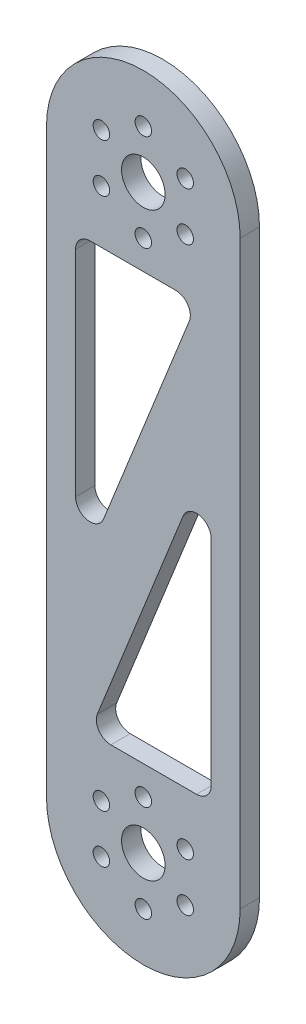
ISO-10303-21;
HEADER;
FILE_DESCRIPTION(('STEP AP214'),'2;1');
FILE_NAME('part.step','',(''),(''),'','','');
FILE_SCHEMA(('AUTOMOTIVE_DESIGN { 1 0 10303 214 1 1 1 1 }'));
ENDSEC;
DATA;
#1=APPLICATION_CONTEXT('core data for automotive mechanical design processes');
#2=APPLICATION_PROTOCOL_DEFINITION('international standard','automotive_design',2000,#1);
#3=PRODUCT_CONTEXT('',#1,'mechanical');
#4=PRODUCT('Part','Part','',(#3));
#5=PRODUCT_RELATED_PRODUCT_CATEGORY('part','',(#4));
#6=PRODUCT_DEFINITION_FORMATION('','',#4);
#7=PRODUCT_DEFINITION_CONTEXT('part definition',#1,'design');
#8=PRODUCT_DEFINITION('design','',#6,#7);
#9=PRODUCT_DEFINITION_SHAPE('','',#8);
#10=(LENGTH_UNIT() NAMED_UNIT(*) SI_UNIT(.MILLI.,.METRE.));
#11=(NAMED_UNIT(*) PLANE_ANGLE_UNIT() SI_UNIT($,.RADIAN.));
#12=(NAMED_UNIT(*) SI_UNIT($,.STERADIAN.) SOLID_ANGLE_UNIT());
#13=UNCERTAINTY_MEASURE_WITH_UNIT(LENGTH_MEASURE(1.E-05),#10,'distance_accuracy_value','');
#14=(GEOMETRIC_REPRESENTATION_CONTEXT(3) GLOBAL_UNCERTAINTY_ASSIGNED_CONTEXT((#13)) GLOBAL_UNIT_ASSIGNED_CONTEXT((#10,
#11,#12)) REPRESENTATION_CONTEXT('',''));
#15=CARTESIAN_POINT('',(0.,0.,0.));
#16=DIRECTION('',(0.,0.,1.));
#17=DIRECTION('',(1.,0.,0.));
#18=AXIS2_PLACEMENT_3D('',#15,#16,#17);
#19=CARTESIAN_POINT('',(0.,-60.,4.));
#20=DIRECTION('',(0.,0.,1.));
#21=DIRECTION('',(1.,0.,0.));
#22=AXIS2_PLACEMENT_3D('',#19,#20,#21);
#23=PLANE('',#22);
#24=CARTESIAN_POINT('',(-8.66025403784427,-54.9999999999998,4.));
#25=DIRECTION('',(0.,0.,1.));
#26=DIRECTION('',(-1.,0.,0.));
#27=AXIS2_PLACEMENT_3D('',#24,#25,#26);
#28=CIRCLE('',#27,1.69999999999973);
#29=CARTESIAN_POINT('',(-10.360254037844,-54.9999999999998,4.));
#30=VERTEX_POINT('',#29);
#31=EDGE_CURVE('E400',#30,#30,#28,.T.);
#32=ORIENTED_EDGE('',*,*,#31,.F.);
#33=EDGE_LOOP('',(#32));
#34=FACE_BOUND('',#33,.T.);
#35=CARTESIAN_POINT('',(-8.66025403784437,-65.,4.));
#36=DIRECTION('',(0.,0.,1.));
#37=DIRECTION('',(-1.,0.,0.));
#38=AXIS2_PLACEMENT_3D('',#35,#36,#37);
#39=CIRCLE('',#38,1.7);
#40=CARTESIAN_POINT('',(-10.3602540378444,-65.,4.));
#41=VERTEX_POINT('',#40);
#42=EDGE_CURVE('E430',#41,#41,#39,.T.);
#43=ORIENTED_EDGE('',*,*,#42,.F.);
#44=EDGE_LOOP('',(#43));
#45=FACE_BOUND('',#44,.T.);
#46=CARTESIAN_POINT('',(0.,-70.,4.));
#47=DIRECTION('',(0.,0.,1.));
#48=DIRECTION('',(-1.,0.,0.));
#49=AXIS2_PLACEMENT_3D('',#46,#47,#48);
#50=CIRCLE('',#49,1.7);
#51=CARTESIAN_POINT('',(-1.69999999999993,-70.,4.));
#52=VERTEX_POINT('',#51);
#53=EDGE_CURVE('E424',#52,#52,#50,.T.);
#54=ORIENTED_EDGE('',*,*,#53,.F.);
#55=EDGE_LOOP('',(#54));
#56=FACE_BOUND('',#55,.T.);
#57=CARTESIAN_POINT('',(8.66025403784415,55.,4.));
#58=DIRECTION('',(0.,0.,1.));
#59=DIRECTION('',(1.,0.,0.));
#60=AXIS2_PLACEMENT_3D('',#57,#58,#59);
#61=CIRCLE('',#60,1.69999999999993);
#62=CARTESIAN_POINT('',(10.3602540378441,55.,4.));
#63=VERTEX_POINT('',#62);
#64=EDGE_CURVE('E418',#63,#63,#61,.T.);
#65=ORIENTED_EDGE('',*,*,#64,.F.);
#66=EDGE_LOOP('',(#65));
#67=FACE_BOUND('',#66,.T.);
#68=CARTESIAN_POINT('',(8.66025403784442,64.9999999999999,4.));
#69=DIRECTION('',(0.,0.,1.));
#70=DIRECTION('',(1.,0.,0.));
#71=AXIS2_PLACEMENT_3D('',#68,#69,#70);
#72=CIRCLE('',#71,1.69999999999999);
#73=CARTESIAN_POINT('',(10.3602540378444,64.9999999999999,4.));
#74=VERTEX_POINT('',#73);
#75=EDGE_CURVE('E417',#74,#74,#72,.T.);
#76=ORIENTED_EDGE('',*,*,#75,.F.);
#77=EDGE_LOOP('',(#76));
#78=FACE_BOUND('',#77,.T.);
#79=CARTESIAN_POINT('',(0.,70.,4.));
#80=DIRECTION('',(0.,0.,1.));
#81=DIRECTION('',(1.,0.,0.));
#82=AXIS2_PLACEMENT_3D('',#79,#80,#81);
#83=CIRCLE('',#82,1.7);
#84=CARTESIAN_POINT('',(1.70000000000007,70.,4.));
#85=VERTEX_POINT('',#84);
#86=EDGE_CURVE('E454',#85,#85,#83,.T.);
#87=ORIENTED_EDGE('',*,*,#86,.F.);
#88=EDGE_LOOP('',(#87));
#89=FACE_BOUND('',#88,.T.);
#90=CARTESIAN_POINT('',(-8.66025403784437,65.,4.));
#91=DIRECTION('',(0.,0.,1.));
#92=DIRECTION('',(1.,0.,0.));
#93=AXIS2_PLACEMENT_3D('',#90,#91,#92);
#94=CIRCLE('',#93,1.7);
#95=CARTESIAN_POINT('',(-6.96025403784436,65.,4.));
#96=VERTEX_POINT('',#95);
#97=EDGE_CURVE('E448',#96,#96,#94,.T.);
#98=ORIENTED_EDGE('',*,*,#97,.F.);
#99=EDGE_LOOP('',(#98));
#100=FACE_BOUND('',#99,.T.);
#101=CARTESIAN_POINT('',(-8.66025403784426,54.9999999999998,4.));
#102=DIRECTION('',(0.,0.,1.));
#103=DIRECTION('',(1.,0.,0.));
#104=AXIS2_PLACEMENT_3D('',#101,#102,#103);
#105=CIRCLE('',#104,1.69999999999974);
#106=CARTESIAN_POINT('',(-6.96025403784452,54.9999999999998,4.));
#107=VERTEX_POINT('',#106);
#108=EDGE_CURVE('E442',#107,#107,#105,.T.);
#109=ORIENTED_EDGE('',*,*,#108,.F.);
#110=EDGE_LOOP('',(#109));
#111=FACE_BOUND('',#110,.T.);
#112=CARTESIAN_POINT('',(0.,-50.,4.));
#113=DIRECTION('',(0.,0.,1.));
#114=DIRECTION('',(-1.,0.,0.));
#115=AXIS2_PLACEMENT_3D('',#112,#113,#114);
#116=CIRCLE('',#115,1.7);
#117=CARTESIAN_POINT('',(-1.7,-50.,4.));
#118=VERTEX_POINT('',#117);
#119=EDGE_CURVE('E396',#118,#118,#116,.T.);
#120=ORIENTED_EDGE('',*,*,#119,.F.);
#121=EDGE_LOOP('',(#120));
#122=FACE_BOUND('',#121,.T.);
#123=CARTESIAN_POINT('',(8.66025403784414,-55.,4.));
#124=DIRECTION('',(0.,0.,1.));
#125=DIRECTION('',(-1.,0.,0.));
#126=AXIS2_PLACEMENT_3D('',#123,#124,#125);
#127=CIRCLE('',#126,1.69999999999994);
#128=CARTESIAN_POINT('',(6.9602540378442,-55.,4.));
#129=VERTEX_POINT('',#128);
#130=EDGE_CURVE('E403',#129,#129,#127,.T.);
#131=ORIENTED_EDGE('',*,*,#130,.F.);
#132=EDGE_LOOP('',(#131));
#133=FACE_BOUND('',#132,.T.);
#134=CARTESIAN_POINT('',(8.66025403784442,-64.9999999999999,4.));
#135=DIRECTION('',(0.,0.,1.));
#136=DIRECTION('',(-1.,0.,0.));
#137=AXIS2_PLACEMENT_3D('',#134,#135,#136);
#138=CIRCLE('',#137,1.69999999999999);
#139=CARTESIAN_POINT('',(6.96025403784443,-64.9999999999999,4.));
#140=VERTEX_POINT('',#139);
#141=EDGE_CURVE('E411',#140,#140,#138,.T.);
#142=ORIENTED_EDGE('',*,*,#141,.F.);
#143=EDGE_LOOP('',(#142));
#144=FACE_BOUND('',#143,.T.);
#145=CARTESIAN_POINT('',(0.,50.,4.));
#146=DIRECTION('',(0.,0.,1.));
#147=DIRECTION('',(1.,0.,0.));
#148=AXIS2_PLACEMENT_3D('',#145,#146,#147);
#149=CIRCLE('',#148,1.7);
#150=CARTESIAN_POINT('',(1.7,50.,4.));
#151=VERTEX_POINT('',#150);
#152=EDGE_CURVE('E441',#151,#151,#149,.T.);
#153=ORIENTED_EDGE('',*,*,#152,.F.);
#154=EDGE_LOOP('',(#153));
#155=FACE_BOUND('',#154,.T.);
#156=DIRECTION('',(1.,0.,0.));
#157=VECTOR('',#156,1.);
#158=CARTESIAN_POINT('',(-11.1378022314386,-44.,4.));
#159=LINE('',#158,#157);
#160=CARTESIAN_POINT('',(-6.70670334715789,-44.,4.));
#161=VERTEX_POINT('',#160);
#162=CARTESIAN_POINT('',(11.,-44.,4.));
#163=VERTEX_POINT('',#162);
#164=EDGE_CURVE('E465',#161,#163,#159,.T.);
#165=ORIENTED_EDGE('',*,*,#164,.F.);
#166=CARTESIAN_POINT('',(-6.70670334715789,-41.,4.));
#167=DIRECTION('',(0.,0.,1.));
#168=DIRECTION('',(1.,0.,0.));
#169=AXIS2_PLACEMENT_3D('',#166,#167,#168);
#170=CIRCLE('',#169,3.);
#171=CARTESIAN_POINT('',(-9.49213341981367,-39.8858279709377,4.));
#172=VERTEX_POINT('',#171);
#173=EDGE_CURVE('E217',#161,#172,#170,.F.);
#174=ORIENTED_EDGE('',*,*,#173,.T.);
#175=DIRECTION('',(-0.371390676354104,-0.928476690885259,0.));
#176=VECTOR('',#175,1.);
#177=CARTESIAN_POINT('',(-11.1378022314386,-44.,4.));
#178=LINE('',#177,#176);
#179=CARTESIAN_POINT('',(8.21456992734423,4.38093039695704,4.));
#180=VERTEX_POINT('',#179);
#181=EDGE_CURVE('E255',#180,#172,#178,.T.);
#182=ORIENTED_EDGE('',*,*,#181,.F.);
#183=CARTESIAN_POINT('',(11.,3.26675836789472,4.));
#184=DIRECTION('',(0.,0.,1.));
#185=DIRECTION('',(1.,0.,0.));
#186=AXIS2_PLACEMENT_3D('',#183,#184,#185);
#187=CIRCLE('',#186,3.);
#188=CARTESIAN_POINT('',(14.,3.26675836789472,4.));
#189=VERTEX_POINT('',#188);
#190=EDGE_CURVE('E209',#180,#189,#187,.F.);
#191=ORIENTED_EDGE('',*,*,#190,.T.);
#192=DIRECTION('',(0.,1.,0.));
#193=VECTOR('',#192,1.);
#194=CARTESIAN_POINT('',(14.,-44.,4.));
#195=LINE('',#194,#193);
#196=CARTESIAN_POINT('',(14.,-41.,4.));
#197=VERTEX_POINT('',#196);
#198=EDGE_CURVE('E477',#197,#189,#195,.T.);
#199=ORIENTED_EDGE('',*,*,#198,.F.);
#200=CARTESIAN_POINT('',(11.,-41.,4.));
#201=DIRECTION('',(0.,0.,1.));
#202=DIRECTION('',(1.,0.,0.));
#203=AXIS2_PLACEMENT_3D('',#200,#201,#202);
#204=CIRCLE('',#203,3.);
#205=EDGE_CURVE('E213',#197,#163,#204,.F.);
#206=ORIENTED_EDGE('',*,*,#205,.T.);
#207=EDGE_LOOP('',(#165,#174,#182,#191,#199,#206));
#208=FACE_BOUND('',#207,.T.);
#209=DIRECTION('',(0.,-1.,0.));
#210=VECTOR('',#209,1.);
#211=CARTESIAN_POINT('',(-14.,-18.8445055785965,4.));
#212=LINE('',#211,#210);
#213=CARTESIAN_POINT('',(-14.,41.,4.));
#214=VERTEX_POINT('',#213);
#215=CARTESIAN_POINT('',(-14.,-3.26675836789474,4.));
#216=VERTEX_POINT('',#215);
#217=EDGE_CURVE('E233',#214,#216,#212,.T.);
#218=ORIENTED_EDGE('',*,*,#217,.F.);
#219=CARTESIAN_POINT('',(-11.,41.,4.));
#220=DIRECTION('',(0.,0.,1.));
#221=DIRECTION('',(1.,0.,0.));
#222=AXIS2_PLACEMENT_3D('',#219,#220,#221);
#223=CIRCLE('',#222,3.);
#224=CARTESIAN_POINT('',(-11.,44.,4.));
#225=VERTEX_POINT('',#224);
#226=EDGE_CURVE('E44',#214,#225,#223,.F.);
#227=ORIENTED_EDGE('',*,*,#226,.T.);
#228=DIRECTION('',(-1.,0.,0.));
#229=VECTOR('',#228,1.);
#230=CARTESIAN_POINT('',(-14.,44.,4.));
#231=LINE('',#230,#229);
#232=CARTESIAN_POINT('',(6.7067033471579,44.,4.));
#233=VERTEX_POINT('',#232);
#234=EDGE_CURVE('E231',#233,#225,#231,.T.);
#235=ORIENTED_EDGE('',*,*,#234,.F.);
#236=CARTESIAN_POINT('',(6.7067033471579,41.,4.));
#237=DIRECTION('',(0.,0.,1.));
#238=DIRECTION('',(1.,0.,0.));
#239=AXIS2_PLACEMENT_3D('',#236,#237,#238);
#240=CIRCLE('',#239,3.);
#241=CARTESIAN_POINT('',(9.49213341981367,39.8858279709377,4.));
#242=VERTEX_POINT('',#241);
#243=EDGE_CURVE('E225',#233,#242,#240,.F.);
#244=ORIENTED_EDGE('',*,*,#243,.T.);
#245=DIRECTION('',(0.371390676354104,0.928476690885259,0.));
#246=VECTOR('',#245,1.);
#247=CARTESIAN_POINT('',(-14.,-18.8445055785965,4.));
#248=LINE('',#247,#246);
#249=CARTESIAN_POINT('',(-8.21456992734422,-4.38093039695705,4.));
#250=VERTEX_POINT('',#249);
#251=EDGE_CURVE('E239',#250,#242,#248,.T.);
#252=ORIENTED_EDGE('',*,*,#251,.F.);
#253=CARTESIAN_POINT('',(-11.,-3.26675836789474,4.));
#254=DIRECTION('',(0.,0.,1.));
#255=DIRECTION('',(1.,0.,0.));
#256=AXIS2_PLACEMENT_3D('',#253,#254,#255);
#257=CIRCLE('',#256,3.);
#258=EDGE_CURVE('E221',#250,#216,#257,.F.);
#259=ORIENTED_EDGE('',*,*,#258,.T.);
#260=EDGE_LOOP('',(#218,#227,#235,#244,#252,#259));
#261=FACE_BOUND('',#260,.T.);
#262=CARTESIAN_POINT('',(0.,-60.,4.));
#263=DIRECTION('',(0.,0.,1.));
#264=DIRECTION('',(1.,0.,0.));
#265=AXIS2_PLACEMENT_3D('',#262,#263,#264);
#266=CIRCLE('',#265,4.5);
#267=CARTESIAN_POINT('',(4.5,-60.,4.));
#268=VERTEX_POINT('',#267);
#269=EDGE_CURVE('E270',#268,#268,#266,.T.);
#270=ORIENTED_EDGE('',*,*,#269,.F.);
#271=EDGE_LOOP('',(#270));
#272=FACE_BOUND('',#271,.T.);
#273=CARTESIAN_POINT('',(0.,-60.,4.));
#274=DIRECTION('',(0.,0.,1.));
#275=DIRECTION('',(1.,0.,0.));
#276=AXIS2_PLACEMENT_3D('',#273,#274,#275);
#277=CIRCLE('',#276,20.);
#278=CARTESIAN_POINT('',(-20.,-60.,4.));
#279=VERTEX_POINT('',#278);
#280=CARTESIAN_POINT('',(20.,-60.,4.));
#281=VERTEX_POINT('',#280);
#282=EDGE_CURVE('E161',#279,#281,#277,.T.);
#283=ORIENTED_EDGE('',*,*,#282,.T.);
#284=DIRECTION('',(0.,1.,0.));
#285=VECTOR('',#284,1.);
#286=CARTESIAN_POINT('',(20.,-60.,4.));
#287=LINE('',#286,#285);
#288=CARTESIAN_POINT('',(20.,60.,4.));
#289=VERTEX_POINT('',#288);
#290=EDGE_CURVE('E150',#281,#289,#287,.T.);
#291=ORIENTED_EDGE('',*,*,#290,.T.);
#292=CARTESIAN_POINT('',(0.,60.,4.));
#293=DIRECTION('',(0.,0.,1.));
#294=DIRECTION('',(1.,0.,0.));
#295=AXIS2_PLACEMENT_3D('',#292,#293,#294);
#296=CIRCLE('',#295,20.);
#297=CARTESIAN_POINT('',(-20.,60.,4.));
#298=VERTEX_POINT('',#297);
#299=EDGE_CURVE('E160',#289,#298,#296,.T.);
#300=ORIENTED_EDGE('',*,*,#299,.T.);
#301=DIRECTION('',(0.,-1.,0.));
#302=VECTOR('',#301,1.);
#303=CARTESIAN_POINT('',(-20.,60.,4.));
#304=LINE('',#303,#302);
#305=EDGE_CURVE('E166',#298,#279,#304,.T.);
#306=ORIENTED_EDGE('',*,*,#305,.T.);
#307=EDGE_LOOP('',(#283,#291,#300,#306));
#308=FACE_BOUND('',#307,.T.);
#309=CARTESIAN_POINT('',(0.,60.,4.));
#310=DIRECTION('',(0.,0.,1.));
#311=DIRECTION('',(1.,0.,0.));
#312=AXIS2_PLACEMENT_3D('',#309,#310,#311);
#313=CIRCLE('',#312,4.5);
#314=CARTESIAN_POINT('',(4.5,60.,4.));
#315=VERTEX_POINT('',#314);
#316=EDGE_CURVE('E264',#315,#315,#313,.T.);
#317=ORIENTED_EDGE('',*,*,#316,.F.);
#318=EDGE_LOOP('',(#317));
#319=FACE_BOUND('',#318,.T.);
#320=ADVANCED_FACE('F36',(#34,#45,#56,#67,#78,#89,#100,#111,#122,#133,#144,#155,#208,#261,#272,
#308,#319),#23,.T.);
#321=CARTESIAN_POINT('',(0.,-60.,0.));
#322=DIRECTION('',(0.,0.,1.));
#323=DIRECTION('',(1.,0.,0.));
#324=AXIS2_PLACEMENT_3D('',#321,#322,#323);
#325=PLANE('',#324);
#326=CARTESIAN_POINT('',(-8.66025403784427,-54.9999999999998,0.));
#327=DIRECTION('',(0.,0.,1.));
#328=DIRECTION('',(-1.,0.,0.));
#329=AXIS2_PLACEMENT_3D('',#326,#327,#328);
#330=CIRCLE('',#329,1.69999999999973);
#331=CARTESIAN_POINT('',(-10.360254037844,-54.9999999999998,0.));
#332=VERTEX_POINT('',#331);
#333=EDGE_CURVE('E433',#332,#332,#330,.T.);
#334=ORIENTED_EDGE('',*,*,#333,.T.);
#335=EDGE_LOOP('',(#334));
#336=FACE_BOUND('',#335,.T.);
#337=CARTESIAN_POINT('',(-8.66025403784437,-65.,0.));
#338=DIRECTION('',(0.,0.,1.));
#339=DIRECTION('',(-1.,0.,0.));
#340=AXIS2_PLACEMENT_3D('',#337,#338,#339);
#341=CIRCLE('',#340,1.7);
#342=CARTESIAN_POINT('',(-10.3602540378444,-65.,0.));
#343=VERTEX_POINT('',#342);
#344=EDGE_CURVE('E427',#343,#343,#341,.T.);
#345=ORIENTED_EDGE('',*,*,#344,.T.);
#346=EDGE_LOOP('',(#345));
#347=FACE_BOUND('',#346,.T.);
#348=CARTESIAN_POINT('',(0.,-70.,0.));
#349=DIRECTION('',(0.,0.,1.));
#350=DIRECTION('',(-1.,0.,0.));
#351=AXIS2_PLACEMENT_3D('',#348,#349,#350);
#352=CIRCLE('',#351,1.7);
#353=CARTESIAN_POINT('',(-1.69999999999993,-70.,0.));
#354=VERTEX_POINT('',#353);
#355=EDGE_CURVE('E421',#354,#354,#352,.T.);
#356=ORIENTED_EDGE('',*,*,#355,.T.);
#357=EDGE_LOOP('',(#356));
#358=FACE_BOUND('',#357,.T.);
#359=CARTESIAN_POINT('',(8.66025403784415,55.,0.));
#360=DIRECTION('',(0.,0.,1.));
#361=DIRECTION('',(1.,0.,0.));
#362=AXIS2_PLACEMENT_3D('',#359,#360,#361);
#363=CIRCLE('',#362,1.69999999999993);
#364=CARTESIAN_POINT('',(10.3602540378441,55.,0.));
#365=VERTEX_POINT('',#364);
#366=EDGE_CURVE('E414',#365,#365,#363,.T.);
#367=ORIENTED_EDGE('',*,*,#366,.T.);
#368=EDGE_LOOP('',(#367));
#369=FACE_BOUND('',#368,.T.);
#370=CARTESIAN_POINT('',(8.66025403784442,64.9999999999999,0.));
#371=DIRECTION('',(0.,0.,1.));
#372=DIRECTION('',(1.,0.,0.));
#373=AXIS2_PLACEMENT_3D('',#370,#371,#372);
#374=CIRCLE('',#373,1.69999999999999);
#375=CARTESIAN_POINT('',(10.3602540378444,64.9999999999999,0.));
#376=VERTEX_POINT('',#375);
#377=EDGE_CURVE('E457',#376,#376,#374,.T.);
#378=ORIENTED_EDGE('',*,*,#377,.T.);
#379=EDGE_LOOP('',(#378));
#380=FACE_BOUND('',#379,.T.);
#381=CARTESIAN_POINT('',(0.,70.,0.));
#382=DIRECTION('',(0.,0.,1.));
#383=DIRECTION('',(1.,0.,0.));
#384=AXIS2_PLACEMENT_3D('',#381,#382,#383);
#385=CIRCLE('',#384,1.7);
#386=CARTESIAN_POINT('',(1.70000000000007,70.,0.));
#387=VERTEX_POINT('',#386);
#388=EDGE_CURVE('E451',#387,#387,#385,.T.);
#389=ORIENTED_EDGE('',*,*,#388,.T.);
#390=EDGE_LOOP('',(#389));
#391=FACE_BOUND('',#390,.T.);
#392=CARTESIAN_POINT('',(-8.66025403784437,65.,0.));
#393=DIRECTION('',(0.,0.,1.));
#394=DIRECTION('',(1.,0.,0.));
#395=AXIS2_PLACEMENT_3D('',#392,#393,#394);
#396=CIRCLE('',#395,1.7);
#397=CARTESIAN_POINT('',(-6.96025403784436,65.,0.));
#398=VERTEX_POINT('',#397);
#399=EDGE_CURVE('E445',#398,#398,#396,.T.);
#400=ORIENTED_EDGE('',*,*,#399,.T.);
#401=EDGE_LOOP('',(#400));
#402=FACE_BOUND('',#401,.T.);
#403=CARTESIAN_POINT('',(-8.66025403784426,54.9999999999998,0.));
#404=DIRECTION('',(0.,0.,1.));
#405=DIRECTION('',(1.,0.,0.));
#406=AXIS2_PLACEMENT_3D('',#403,#404,#405);
#407=CIRCLE('',#406,1.69999999999974);
#408=CARTESIAN_POINT('',(-6.96025403784452,54.9999999999998,0.));
#409=VERTEX_POINT('',#408);
#410=EDGE_CURVE('E438',#409,#409,#407,.T.);
#411=ORIENTED_EDGE('',*,*,#410,.T.);
#412=EDGE_LOOP('',(#411));
#413=FACE_BOUND('',#412,.T.);
#414=CARTESIAN_POINT('',(0.,-50.,0.));
#415=DIRECTION('',(0.,0.,1.));
#416=DIRECTION('',(-1.,0.,0.));
#417=AXIS2_PLACEMENT_3D('',#414,#415,#416);
#418=CIRCLE('',#417,1.7);
#419=CARTESIAN_POINT('',(-1.7,-50.,0.));
#420=VERTEX_POINT('',#419);
#421=EDGE_CURVE('E393',#420,#420,#418,.T.);
#422=ORIENTED_EDGE('',*,*,#421,.T.);
#423=EDGE_LOOP('',(#422));
#424=FACE_BOUND('',#423,.T.);
#425=CARTESIAN_POINT('',(8.66025403784414,-55.,0.));
#426=DIRECTION('',(0.,0.,1.));
#427=DIRECTION('',(-1.,0.,0.));
#428=AXIS2_PLACEMENT_3D('',#425,#426,#427);
#429=CIRCLE('',#428,1.69999999999994);
#430=CARTESIAN_POINT('',(6.9602540378442,-55.,0.));
#431=VERTEX_POINT('',#430);
#432=EDGE_CURVE('E398',#431,#431,#429,.T.);
#433=ORIENTED_EDGE('',*,*,#432,.T.);
#434=EDGE_LOOP('',(#433));
#435=FACE_BOUND('',#434,.T.);
#436=CARTESIAN_POINT('',(8.66025403784442,-64.9999999999999,0.));
#437=DIRECTION('',(0.,0.,1.));
#438=DIRECTION('',(-1.,0.,0.));
#439=AXIS2_PLACEMENT_3D('',#436,#437,#438);
#440=CIRCLE('',#439,1.69999999999999);
#441=CARTESIAN_POINT('',(6.96025403784443,-64.9999999999999,0.));
#442=VERTEX_POINT('',#441);
#443=EDGE_CURVE('E408',#442,#442,#440,.T.);
#444=ORIENTED_EDGE('',*,*,#443,.T.);
#445=EDGE_LOOP('',(#444));
#446=FACE_BOUND('',#445,.T.);
#447=CARTESIAN_POINT('',(0.,50.,0.));
#448=DIRECTION('',(0.,0.,1.));
#449=DIRECTION('',(1.,0.,0.));
#450=AXIS2_PLACEMENT_3D('',#447,#448,#449);
#451=CIRCLE('',#450,1.7);
#452=CARTESIAN_POINT('',(1.7,50.,0.));
#453=VERTEX_POINT('',#452);
#454=EDGE_CURVE('E462',#453,#453,#451,.T.);
#455=ORIENTED_EDGE('',*,*,#454,.T.);
#456=EDGE_LOOP('',(#455));
#457=FACE_BOUND('',#456,.T.);
#458=DIRECTION('',(0.,1.,0.));
#459=VECTOR('',#458,1.);
#460=CARTESIAN_POINT('',(14.,-44.,0.));
#461=LINE('',#460,#459);
#462=CARTESIAN_POINT('',(14.,-41.,0.));
#463=VERTEX_POINT('',#462);
#464=CARTESIAN_POINT('',(14.,3.26675836789472,0.));
#465=VERTEX_POINT('',#464);
#466=EDGE_CURVE('E471',#463,#465,#461,.T.);
#467=ORIENTED_EDGE('',*,*,#466,.T.);
#468=CARTESIAN_POINT('',(11.,3.26675836789472,0.));
#469=DIRECTION('',(0.,0.,1.));
#470=DIRECTION('',(1.,0.,0.));
#471=AXIS2_PLACEMENT_3D('',#468,#469,#470);
#472=CIRCLE('',#471,3.);
#473=CARTESIAN_POINT('',(8.21456992734423,4.38093039695704,0.));
#474=VERTEX_POINT('',#473);
#475=EDGE_CURVE('E211',#465,#474,#472,.T.);
#476=ORIENTED_EDGE('',*,*,#475,.T.);
#477=DIRECTION('',(-0.371390676354104,-0.928476690885259,0.));
#478=VECTOR('',#477,1.);
#479=CARTESIAN_POINT('',(-11.1378022314386,-44.,0.));
#480=LINE('',#479,#478);
#481=CARTESIAN_POINT('',(-9.49213341981367,-39.8858279709377,0.));
#482=VERTEX_POINT('',#481);
#483=EDGE_CURVE('E261',#474,#482,#480,.T.);
#484=ORIENTED_EDGE('',*,*,#483,.T.);
#485=CARTESIAN_POINT('',(-6.70670334715789,-41.,0.));
#486=DIRECTION('',(0.,0.,1.));
#487=DIRECTION('',(1.,0.,0.));
#488=AXIS2_PLACEMENT_3D('',#485,#486,#487);
#489=CIRCLE('',#488,3.);
#490=CARTESIAN_POINT('',(-6.70670334715789,-44.,0.));
#491=VERTEX_POINT('',#490);
#492=EDGE_CURVE('E219',#482,#491,#489,.T.);
#493=ORIENTED_EDGE('',*,*,#492,.T.);
#494=DIRECTION('',(1.,0.,0.));
#495=VECTOR('',#494,1.);
#496=CARTESIAN_POINT('',(-11.1378022314386,-44.,0.));
#497=LINE('',#496,#495);
#498=CARTESIAN_POINT('',(11.,-44.,0.));
#499=VERTEX_POINT('',#498);
#500=EDGE_CURVE('E468',#491,#499,#497,.T.);
#501=ORIENTED_EDGE('',*,*,#500,.T.);
#502=CARTESIAN_POINT('',(11.,-41.,0.));
#503=DIRECTION('',(0.,0.,1.));
#504=DIRECTION('',(1.,0.,0.));
#505=AXIS2_PLACEMENT_3D('',#502,#503,#504);
#506=CIRCLE('',#505,3.);
#507=EDGE_CURVE('E215',#499,#463,#506,.T.);
#508=ORIENTED_EDGE('',*,*,#507,.T.);
#509=EDGE_LOOP('',(#467,#476,#484,#493,#501,#508));
#510=FACE_BOUND('',#509,.T.);
#511=DIRECTION('',(0.371390676354104,0.928476690885259,0.));
#512=VECTOR('',#511,1.);
#513=CARTESIAN_POINT('',(-14.,-18.8445055785965,0.));
#514=LINE('',#513,#512);
#515=CARTESIAN_POINT('',(-8.21456992734422,-4.38093039695705,0.));
#516=VERTEX_POINT('',#515);
#517=CARTESIAN_POINT('',(9.49213341981367,39.8858279709377,0.));
#518=VERTEX_POINT('',#517);
#519=EDGE_CURVE('E251',#516,#518,#514,.T.);
#520=ORIENTED_EDGE('',*,*,#519,.T.);
#521=CARTESIAN_POINT('',(6.7067033471579,41.,0.));
#522=DIRECTION('',(0.,0.,1.));
#523=DIRECTION('',(1.,0.,0.));
#524=AXIS2_PLACEMENT_3D('',#521,#522,#523);
#525=CIRCLE('',#524,3.);
#526=CARTESIAN_POINT('',(6.7067033471579,44.,0.));
#527=VERTEX_POINT('',#526);
#528=EDGE_CURVE('E58',#518,#527,#525,.T.);
#529=ORIENTED_EDGE('',*,*,#528,.T.);
#530=DIRECTION('',(-1.,0.,0.));
#531=VECTOR('',#530,1.);
#532=CARTESIAN_POINT('',(-14.,44.,0.));
#533=LINE('',#532,#531);
#534=CARTESIAN_POINT('',(-11.,44.,0.));
#535=VERTEX_POINT('',#534);
#536=EDGE_CURVE('E247',#527,#535,#533,.T.);
#537=ORIENTED_EDGE('',*,*,#536,.T.);
#538=CARTESIAN_POINT('',(-11.,41.,0.));
#539=DIRECTION('',(0.,0.,1.));
#540=DIRECTION('',(1.,0.,0.));
#541=AXIS2_PLACEMENT_3D('',#538,#539,#540);
#542=CIRCLE('',#541,3.);
#543=CARTESIAN_POINT('',(-14.,41.,0.));
#544=VERTEX_POINT('',#543);
#545=EDGE_CURVE('E11',#535,#544,#542,.T.);
#546=ORIENTED_EDGE('',*,*,#545,.T.);
#547=DIRECTION('',(0.,-1.,0.));
#548=VECTOR('',#547,1.);
#549=CARTESIAN_POINT('',(-14.,-18.8445055785965,0.));
#550=LINE('',#549,#548);
#551=CARTESIAN_POINT('',(-14.,-3.26675836789474,0.));
#552=VERTEX_POINT('',#551);
#553=EDGE_CURVE('E238',#544,#552,#550,.T.);
#554=ORIENTED_EDGE('',*,*,#553,.T.);
#555=CARTESIAN_POINT('',(-11.,-3.26675836789474,0.));
#556=DIRECTION('',(0.,0.,1.));
#557=DIRECTION('',(1.,0.,0.));
#558=AXIS2_PLACEMENT_3D('',#555,#556,#557);
#559=CIRCLE('',#558,3.);
#560=EDGE_CURVE('E223',#552,#516,#559,.T.);
#561=ORIENTED_EDGE('',*,*,#560,.T.);
#562=EDGE_LOOP('',(#520,#529,#537,#546,#554,#561));
#563=FACE_BOUND('',#562,.T.);
#564=CARTESIAN_POINT('',(0.,-60.,0.));
#565=DIRECTION('',(0.,0.,1.));
#566=DIRECTION('',(1.,0.,0.));
#567=AXIS2_PLACEMENT_3D('',#564,#565,#566);
#568=CIRCLE('',#567,20.);
#569=CARTESIAN_POINT('',(-20.,-60.,0.));
#570=VERTEX_POINT('',#569);
#571=CARTESIAN_POINT('',(20.,-60.,0.));
#572=VERTEX_POINT('',#571);
#573=EDGE_CURVE('E174',#570,#572,#568,.T.);
#574=ORIENTED_EDGE('',*,*,#573,.F.);
#575=DIRECTION('',(0.,-1.,0.));
#576=VECTOR('',#575,1.);
#577=CARTESIAN_POINT('',(-20.,60.,0.));
#578=LINE('',#577,#576);
#579=CARTESIAN_POINT('',(-20.,60.,0.));
#580=VERTEX_POINT('',#579);
#581=EDGE_CURVE('E170',#580,#570,#578,.T.);
#582=ORIENTED_EDGE('',*,*,#581,.F.);
#583=CARTESIAN_POINT('',(0.,60.,0.));
#584=DIRECTION('',(0.,0.,1.));
#585=DIRECTION('',(1.,0.,0.));
#586=AXIS2_PLACEMENT_3D('',#583,#584,#585);
#587=CIRCLE('',#586,20.);
#588=CARTESIAN_POINT('',(20.,60.,0.));
#589=VERTEX_POINT('',#588);
#590=EDGE_CURVE('E281',#589,#580,#587,.T.);
#591=ORIENTED_EDGE('',*,*,#590,.F.);
#592=DIRECTION('',(0.,1.,0.));
#593=VECTOR('',#592,1.);
#594=CARTESIAN_POINT('',(20.,-60.,0.));
#595=LINE('',#594,#593);
#596=EDGE_CURVE('E279',#572,#589,#595,.T.);
#597=ORIENTED_EDGE('',*,*,#596,.F.);
#598=EDGE_LOOP('',(#574,#582,#591,#597));
#599=FACE_BOUND('',#598,.T.);
#600=CARTESIAN_POINT('',(0.,-60.,0.));
#601=DIRECTION('',(0.,0.,1.));
#602=DIRECTION('',(1.,0.,0.));
#603=AXIS2_PLACEMENT_3D('',#600,#601,#602);
#604=CIRCLE('',#603,4.5);
#605=CARTESIAN_POINT('',(4.5,-60.,0.));
#606=VERTEX_POINT('',#605);
#607=EDGE_CURVE('E267',#606,#606,#604,.T.);
#608=ORIENTED_EDGE('',*,*,#607,.T.);
#609=EDGE_LOOP('',(#608));
#610=FACE_BOUND('',#609,.T.);
#611=CARTESIAN_POINT('',(0.,60.,0.));
#612=DIRECTION('',(0.,0.,1.));
#613=DIRECTION('',(1.,0.,0.));
#614=AXIS2_PLACEMENT_3D('',#611,#612,#613);
#615=CIRCLE('',#614,4.5);
#616=CARTESIAN_POINT('',(4.5,60.,0.));
#617=VERTEX_POINT('',#616);
#618=EDGE_CURVE('E259',#617,#617,#615,.T.);
#619=ORIENTED_EDGE('',*,*,#618,.T.);
#620=EDGE_LOOP('',(#619));
#621=FACE_BOUND('',#620,.T.);
#622=ADVANCED_FACE('F244',(#336,#347,#358,#369,#380,#391,#402,#413,#424,#435,#446,#457,#510,
#563,#599,#610,#621),#325,.F.);
#623=CARTESIAN_POINT('',(0.,-60.,4.));
#624=DIRECTION('',(0.,0.,-1.));
#625=DIRECTION('',(-1.,0.,0.));
#626=AXIS2_PLACEMENT_3D('',#623,#624,#625);
#627=CYLINDRICAL_SURFACE('',#626,20.);
#628=ORIENTED_EDGE('',*,*,#573,.T.);
#629=DIRECTION('',(0.,0.,-1.));
#630=VECTOR('',#629,1.);
#631=CARTESIAN_POINT('',(20.,-60.,4.));
#632=LINE('',#631,#630);
#633=EDGE_CURVE('E154',#281,#572,#632,.T.);
#634=ORIENTED_EDGE('',*,*,#633,.F.);
#635=ORIENTED_EDGE('',*,*,#282,.F.);
#636=DIRECTION('',(0.,0.,-1.));
#637=VECTOR('',#636,1.);
#638=CARTESIAN_POINT('',(-20.,-60.,4.));
#639=LINE('',#638,#637);
#640=EDGE_CURVE('E277',#279,#570,#639,.T.);
#641=ORIENTED_EDGE('',*,*,#640,.T.);
#642=EDGE_LOOP('',(#628,#634,#635,#641));
#643=FACE_BOUND('',#642,.T.);
#644=ADVANCED_FACE('F172',(#643),#627,.T.);
#645=CARTESIAN_POINT('',(20.,-60.,4.));
#646=DIRECTION('',(-1.,0.,0.));
#647=DIRECTION('',(0.,-1.,0.));
#648=AXIS2_PLACEMENT_3D('',#645,#646,#647);
#649=PLANE('',#648);
#650=ORIENTED_EDGE('',*,*,#596,.T.);
#651=DIRECTION('',(0.,0.,-1.));
#652=VECTOR('',#651,1.);
#653=CARTESIAN_POINT('',(20.,60.,4.));
#654=LINE('',#653,#652);
#655=EDGE_CURVE('E157',#289,#589,#654,.T.);
#656=ORIENTED_EDGE('',*,*,#655,.F.);
#657=ORIENTED_EDGE('',*,*,#290,.F.);
#658=ORIENTED_EDGE('',*,*,#633,.T.);
#659=EDGE_LOOP('',(#650,#656,#657,#658));
#660=FACE_BOUND('',#659,.T.);
#661=ADVANCED_FACE('F152',(#660),#649,.F.);
#662=CARTESIAN_POINT('',(0.,60.,4.));
#663=DIRECTION('',(0.,0.,-1.));
#664=DIRECTION('',(-1.,0.,0.));
#665=AXIS2_PLACEMENT_3D('',#662,#663,#664);
#666=CYLINDRICAL_SURFACE('',#665,20.);
#667=ORIENTED_EDGE('',*,*,#590,.T.);
#668=DIRECTION('',(0.,0.,-1.));
#669=VECTOR('',#668,1.);
#670=CARTESIAN_POINT('',(-20.,60.,4.));
#671=LINE('',#670,#669);
#672=EDGE_CURVE('E179',#298,#580,#671,.T.);
#673=ORIENTED_EDGE('',*,*,#672,.F.);
#674=ORIENTED_EDGE('',*,*,#299,.F.);
#675=ORIENTED_EDGE('',*,*,#655,.T.);
#676=EDGE_LOOP('',(#667,#673,#674,#675));
#677=FACE_BOUND('',#676,.T.);
#678=ADVANCED_FACE('F292',(#677),#666,.T.);
#679=CARTESIAN_POINT('',(-20.,60.,4.));
#680=DIRECTION('',(1.,0.,0.));
#681=DIRECTION('',(0.,1.,0.));
#682=AXIS2_PLACEMENT_3D('',#679,#680,#681);
#683=PLANE('',#682);
#684=ORIENTED_EDGE('',*,*,#581,.T.);
#685=ORIENTED_EDGE('',*,*,#640,.F.);
#686=ORIENTED_EDGE('',*,*,#305,.F.);
#687=ORIENTED_EDGE('',*,*,#672,.T.);
#688=EDGE_LOOP('',(#684,#685,#686,#687));
#689=FACE_BOUND('',#688,.T.);
#690=ADVANCED_FACE('F288',(#689),#683,.F.);
#691=CARTESIAN_POINT('',(0.,-60.,4.));
#692=DIRECTION('',(0.,0.,-1.));
#693=DIRECTION('',(-1.,0.,0.));
#694=AXIS2_PLACEMENT_3D('',#691,#692,#693);
#695=CYLINDRICAL_SURFACE('',#694,4.5);
#696=ORIENTED_EDGE('',*,*,#269,.T.);
#697=EDGE_LOOP('',(#696));
#698=FACE_BOUND('',#697,.T.);
#699=ORIENTED_EDGE('',*,*,#607,.F.);
#700=EDGE_LOOP('',(#699));
#701=FACE_BOUND('',#700,.T.);
#702=ADVANCED_FACE('F299',(#698,#701),#695,.F.);
#703=CARTESIAN_POINT('',(0.,60.,4.));
#704=DIRECTION('',(0.,0.,-1.));
#705=DIRECTION('',(-1.,0.,0.));
#706=AXIS2_PLACEMENT_3D('',#703,#704,#705);
#707=CYLINDRICAL_SURFACE('',#706,4.5);
#708=ORIENTED_EDGE('',*,*,#316,.T.);
#709=EDGE_LOOP('',(#708));
#710=FACE_BOUND('',#709,.T.);
#711=ORIENTED_EDGE('',*,*,#618,.F.);
#712=EDGE_LOOP('',(#711));
#713=FACE_BOUND('',#712,.T.);
#714=ADVANCED_FACE('F315',(#710,#713),#707,.F.);
#715=CARTESIAN_POINT('',(-14.,-18.8445055785965,0.));
#716=DIRECTION('',(-1.,0.,0.));
#717=DIRECTION('',(0.,0.,1.));
#718=AXIS2_PLACEMENT_3D('',#715,#716,#717);
#719=PLANE('',#718);
#720=ORIENTED_EDGE('',*,*,#217,.T.);
#721=DIRECTION('',(0.,0.,1.));
#722=VECTOR('',#721,1.);
#723=CARTESIAN_POINT('',(-14.,-3.26675836789474,0.));
#724=LINE('',#723,#722);
#725=EDGE_CURVE('E203',#216,#552,#724,.F.);
#726=ORIENTED_EDGE('',*,*,#725,.T.);
#727=ORIENTED_EDGE('',*,*,#553,.F.);
#728=DIRECTION('',(0.,0.,1.));
#729=VECTOR('',#728,1.);
#730=CARTESIAN_POINT('',(-14.,41.,4.));
#731=LINE('',#730,#729);
#732=EDGE_CURVE('E200',#544,#214,#731,.T.);
#733=ORIENTED_EDGE('',*,*,#732,.T.);
#734=EDGE_LOOP('',(#720,#726,#727,#733));
#735=FACE_BOUND('',#734,.T.);
#736=ADVANCED_FACE('F249',(#735),#719,.F.);
#737=CARTESIAN_POINT('',(-14.,44.,0.));
#738=DIRECTION('',(0.,1.,0.));
#739=DIRECTION('',(-1.,0.,0.));
#740=AXIS2_PLACEMENT_3D('',#737,#738,#739);
#741=PLANE('',#740);
#742=ORIENTED_EDGE('',*,*,#536,.F.);
#743=DIRECTION('',(0.,0.,1.));
#744=VECTOR('',#743,1.);
#745=CARTESIAN_POINT('',(6.7067033471579,44.,4.));
#746=LINE('',#745,#744);
#747=EDGE_CURVE('E206',#527,#233,#746,.T.);
#748=ORIENTED_EDGE('',*,*,#747,.T.);
#749=ORIENTED_EDGE('',*,*,#234,.T.);
#750=DIRECTION('',(0.,0.,1.));
#751=VECTOR('',#750,1.);
#752=CARTESIAN_POINT('',(-11.,44.,0.));
#753=LINE('',#752,#751);
#754=EDGE_CURVE('E51',#225,#535,#753,.F.);
#755=ORIENTED_EDGE('',*,*,#754,.T.);
#756=EDGE_LOOP('',(#742,#748,#749,#755));
#757=FACE_BOUND('',#756,.T.);
#758=ADVANCED_FACE('F236',(#757),#741,.F.);
#759=CARTESIAN_POINT('',(-14.,-18.8445055785965,0.));
#760=DIRECTION('',(0.928476690885259,-0.371390676354104,0.));
#761=DIRECTION('',(0.371390676354104,0.928476690885259,0.));
#762=AXIS2_PLACEMENT_3D('',#759,#760,#761);
#763=PLANE('',#762);
#764=ORIENTED_EDGE('',*,*,#519,.F.);
#765=DIRECTION('',(0.,0.,1.));
#766=VECTOR('',#765,1.);
#767=CARTESIAN_POINT('',(-8.21456992734422,-4.38093039695705,4.));
#768=LINE('',#767,#766);
#769=EDGE_CURVE('E197',#516,#250,#768,.T.);
#770=ORIENTED_EDGE('',*,*,#769,.T.);
#771=ORIENTED_EDGE('',*,*,#251,.T.);
#772=DIRECTION('',(0.,0.,1.));
#773=VECTOR('',#772,1.);
#774=CARTESIAN_POINT('',(9.49213341981367,39.8858279709377,0.));
#775=LINE('',#774,#773);
#776=EDGE_CURVE('E195',#242,#518,#775,.F.);
#777=ORIENTED_EDGE('',*,*,#776,.T.);
#778=EDGE_LOOP('',(#764,#770,#771,#777));
#779=FACE_BOUND('',#778,.T.);
#780=ADVANCED_FACE('F322',(#779),#763,.F.);
#781=CARTESIAN_POINT('',(-11.1378022314386,-44.,0.));
#782=DIRECTION('',(0.,-1.,0.));
#783=DIRECTION('',(0.,0.,-1.));
#784=AXIS2_PLACEMENT_3D('',#781,#782,#783);
#785=PLANE('',#784);
#786=ORIENTED_EDGE('',*,*,#164,.T.);
#787=DIRECTION('',(0.,0.,1.));
#788=VECTOR('',#787,1.);
#789=CARTESIAN_POINT('',(11.,-44.,0.));
#790=LINE('',#789,#788);
#791=EDGE_CURVE('E193',#163,#499,#790,.F.);
#792=ORIENTED_EDGE('',*,*,#791,.T.);
#793=ORIENTED_EDGE('',*,*,#500,.F.);
#794=DIRECTION('',(0.,0.,1.));
#795=VECTOR('',#794,1.);
#796=CARTESIAN_POINT('',(-6.70670334715789,-44.,4.));
#797=LINE('',#796,#795);
#798=EDGE_CURVE('E190',#491,#161,#797,.T.);
#799=ORIENTED_EDGE('',*,*,#798,.T.);
#800=EDGE_LOOP('',(#786,#792,#793,#799));
#801=FACE_BOUND('',#800,.T.);
#802=ADVANCED_FACE('F325',(#801),#785,.F.);
#803=CARTESIAN_POINT('',(-11.1378022314386,-44.,0.));
#804=DIRECTION('',(-0.928476690885259,0.371390676354104,0.));
#805=DIRECTION('',(-0.371390676354104,-0.928476690885259,0.));
#806=AXIS2_PLACEMENT_3D('',#803,#804,#805);
#807=PLANE('',#806);
#808=ORIENTED_EDGE('',*,*,#483,.F.);
#809=DIRECTION('',(0.,0.,1.));
#810=VECTOR('',#809,1.);
#811=CARTESIAN_POINT('',(8.21456992734423,4.38093039695703,4.));
#812=LINE('',#811,#810);
#813=EDGE_CURVE('E177',#474,#180,#812,.T.);
#814=ORIENTED_EDGE('',*,*,#813,.T.);
#815=ORIENTED_EDGE('',*,*,#181,.T.);
#816=DIRECTION('',(0.,0.,1.));
#817=VECTOR('',#816,1.);
#818=CARTESIAN_POINT('',(-9.49213341981367,-39.8858279709377,0.));
#819=LINE('',#818,#817);
#820=EDGE_CURVE('E175',#172,#482,#819,.F.);
#821=ORIENTED_EDGE('',*,*,#820,.T.);
#822=EDGE_LOOP('',(#808,#814,#815,#821));
#823=FACE_BOUND('',#822,.T.);
#824=ADVANCED_FACE('F331',(#823),#807,.F.);
#825=CARTESIAN_POINT('',(14.,-44.,0.));
#826=DIRECTION('',(1.,0.,0.));
#827=DIRECTION('',(0.,0.,-1.));
#828=AXIS2_PLACEMENT_3D('',#825,#826,#827);
#829=PLANE('',#828);
#830=ORIENTED_EDGE('',*,*,#198,.T.);
#831=DIRECTION('',(0.,0.,1.));
#832=VECTOR('',#831,1.);
#833=CARTESIAN_POINT('',(14.,3.26675836789472,0.));
#834=LINE('',#833,#832);
#835=EDGE_CURVE('E188',#189,#465,#834,.F.);
#836=ORIENTED_EDGE('',*,*,#835,.T.);
#837=ORIENTED_EDGE('',*,*,#466,.F.);
#838=DIRECTION('',(0.,0.,1.));
#839=VECTOR('',#838,1.);
#840=CARTESIAN_POINT('',(14.,-41.,4.));
#841=LINE('',#840,#839);
#842=EDGE_CURVE('E185',#463,#197,#841,.T.);
#843=ORIENTED_EDGE('',*,*,#842,.T.);
#844=EDGE_LOOP('',(#830,#836,#837,#843));
#845=FACE_BOUND('',#844,.T.);
#846=ADVANCED_FACE('F333',(#845),#829,.F.);
#847=CARTESIAN_POINT('',(11.,3.26675836789472,0.));
#848=DIRECTION('',(0.,0.,-1.));
#849=DIRECTION('',(-1.,0.,0.));
#850=AXIS2_PLACEMENT_3D('',#847,#848,#849);
#851=CYLINDRICAL_SURFACE('',#850,3.);
#852=ORIENTED_EDGE('',*,*,#475,.F.);
#853=ORIENTED_EDGE('',*,*,#835,.F.);
#854=ORIENTED_EDGE('',*,*,#190,.F.);
#855=ORIENTED_EDGE('',*,*,#813,.F.);
#856=EDGE_LOOP('',(#852,#853,#854,#855));
#857=FACE_BOUND('',#856,.T.);
#858=ADVANCED_FACE('F336',(#857),#851,.F.);
#859=CARTESIAN_POINT('',(11.,-41.,0.));
#860=DIRECTION('',(0.,0.,-1.));
#861=DIRECTION('',(-1.,0.,0.));
#862=AXIS2_PLACEMENT_3D('',#859,#860,#861);
#863=CYLINDRICAL_SURFACE('',#862,3.);
#864=ORIENTED_EDGE('',*,*,#507,.F.);
#865=ORIENTED_EDGE('',*,*,#791,.F.);
#866=ORIENTED_EDGE('',*,*,#205,.F.);
#867=ORIENTED_EDGE('',*,*,#842,.F.);
#868=EDGE_LOOP('',(#864,#865,#866,#867));
#869=FACE_BOUND('',#868,.T.);
#870=ADVANCED_FACE('F497',(#869),#863,.F.);
#871=CARTESIAN_POINT('',(-6.70670334715789,-41.,0.));
#872=DIRECTION('',(0.,0.,-1.));
#873=DIRECTION('',(-1.,0.,0.));
#874=AXIS2_PLACEMENT_3D('',#871,#872,#873);
#875=CYLINDRICAL_SURFACE('',#874,3.);
#876=ORIENTED_EDGE('',*,*,#492,.F.);
#877=ORIENTED_EDGE('',*,*,#820,.F.);
#878=ORIENTED_EDGE('',*,*,#173,.F.);
#879=ORIENTED_EDGE('',*,*,#798,.F.);
#880=EDGE_LOOP('',(#876,#877,#878,#879));
#881=FACE_BOUND('',#880,.T.);
#882=ADVANCED_FACE('F489',(#881),#875,.F.);
#883=CARTESIAN_POINT('',(-11.,-3.26675836789474,0.));
#884=DIRECTION('',(0.,0.,-1.));
#885=DIRECTION('',(-1.,0.,0.));
#886=AXIS2_PLACEMENT_3D('',#883,#884,#885);
#887=CYLINDRICAL_SURFACE('',#886,3.);
#888=ORIENTED_EDGE('',*,*,#560,.F.);
#889=ORIENTED_EDGE('',*,*,#725,.F.);
#890=ORIENTED_EDGE('',*,*,#258,.F.);
#891=ORIENTED_EDGE('',*,*,#769,.F.);
#892=EDGE_LOOP('',(#888,#889,#890,#891));
#893=FACE_BOUND('',#892,.T.);
#894=ADVANCED_FACE('F512',(#893),#887,.F.);
#895=CARTESIAN_POINT('',(6.7067033471579,41.,0.));
#896=DIRECTION('',(0.,0.,-1.));
#897=DIRECTION('',(-1.,0.,0.));
#898=AXIS2_PLACEMENT_3D('',#895,#896,#897);
#899=CYLINDRICAL_SURFACE('',#898,3.);
#900=ORIENTED_EDGE('',*,*,#528,.F.);
#901=ORIENTED_EDGE('',*,*,#776,.F.);
#902=ORIENTED_EDGE('',*,*,#243,.F.);
#903=ORIENTED_EDGE('',*,*,#747,.F.);
#904=EDGE_LOOP('',(#900,#901,#902,#903));
#905=FACE_BOUND('',#904,.T.);
#906=ADVANCED_FACE('F514',(#905),#899,.F.);
#907=CARTESIAN_POINT('',(-11.,41.,0.));
#908=DIRECTION('',(0.,0.,-1.));
#909=DIRECTION('',(-1.,0.,0.));
#910=AXIS2_PLACEMENT_3D('',#907,#908,#909);
#911=CYLINDRICAL_SURFACE('',#910,3.);
#912=ORIENTED_EDGE('',*,*,#545,.F.);
#913=ORIENTED_EDGE('',*,*,#754,.F.);
#914=ORIENTED_EDGE('',*,*,#226,.F.);
#915=ORIENTED_EDGE('',*,*,#732,.F.);
#916=EDGE_LOOP('',(#912,#913,#914,#915));
#917=FACE_BOUND('',#916,.T.);
#918=ADVANCED_FACE('F38',(#917),#911,.F.);
#919=CARTESIAN_POINT('',(0.,50.,0.));
#920=DIRECTION('',(0.,0.,1.));
#921=DIRECTION('',(1.,0.,0.));
#922=AXIS2_PLACEMENT_3D('',#919,#920,#921);
#923=CYLINDRICAL_SURFACE('',#922,1.7);
#924=ORIENTED_EDGE('',*,*,#454,.F.);
#925=EDGE_LOOP('',(#924));
#926=FACE_BOUND('',#925,.T.);
#927=ORIENTED_EDGE('',*,*,#152,.T.);
#928=EDGE_LOOP('',(#927));
#929=FACE_BOUND('',#928,.T.);
#930=ADVANCED_FACE('F341',(#926,#929),#923,.F.);
#931=CARTESIAN_POINT('',(8.66025403784442,-64.9999999999999,0.));
#932=DIRECTION('',(0.,0.,1.));
#933=DIRECTION('',(1.,0.,0.));
#934=AXIS2_PLACEMENT_3D('',#931,#932,#933);
#935=CYLINDRICAL_SURFACE('',#934,1.69999999999999);
#936=ORIENTED_EDGE('',*,*,#443,.F.);
#937=EDGE_LOOP('',(#936));
#938=FACE_BOUND('',#937,.T.);
#939=ORIENTED_EDGE('',*,*,#141,.T.);
#940=EDGE_LOOP('',(#939));
#941=FACE_BOUND('',#940,.T.);
#942=ADVANCED_FACE('F344',(#938,#941),#935,.F.);
#943=CARTESIAN_POINT('',(8.66025403784414,-55.,0.));
#944=DIRECTION('',(0.,0.,1.));
#945=DIRECTION('',(1.,0.,0.));
#946=AXIS2_PLACEMENT_3D('',#943,#944,#945);
#947=CYLINDRICAL_SURFACE('',#946,1.69999999999994);
#948=ORIENTED_EDGE('',*,*,#432,.F.);
#949=EDGE_LOOP('',(#948));
#950=FACE_BOUND('',#949,.T.);
#951=ORIENTED_EDGE('',*,*,#130,.T.);
#952=EDGE_LOOP('',(#951));
#953=FACE_BOUND('',#952,.T.);
#954=ADVANCED_FACE('F381',(#950,#953),#947,.F.);
#955=CARTESIAN_POINT('',(0.,-50.,0.));
#956=DIRECTION('',(0.,0.,1.));
#957=DIRECTION('',(1.,0.,0.));
#958=AXIS2_PLACEMENT_3D('',#955,#956,#957);
#959=CYLINDRICAL_SURFACE('',#958,1.7);
#960=ORIENTED_EDGE('',*,*,#421,.F.);
#961=EDGE_LOOP('',(#960));
#962=FACE_BOUND('',#961,.T.);
#963=ORIENTED_EDGE('',*,*,#119,.T.);
#964=EDGE_LOOP('',(#963));
#965=FACE_BOUND('',#964,.T.);
#966=ADVANCED_FACE('F362',(#962,#965),#959,.F.);
#967=CARTESIAN_POINT('',(-8.66025403784426,54.9999999999998,0.));
#968=DIRECTION('',(0.,0.,1.));
#969=DIRECTION('',(1.,0.,0.));
#970=AXIS2_PLACEMENT_3D('',#967,#968,#969);
#971=CYLINDRICAL_SURFACE('',#970,1.69999999999974);
#972=ORIENTED_EDGE('',*,*,#410,.F.);
#973=EDGE_LOOP('',(#972));
#974=FACE_BOUND('',#973,.T.);
#975=ORIENTED_EDGE('',*,*,#108,.T.);
#976=EDGE_LOOP('',(#975));
#977=FACE_BOUND('',#976,.T.);
#978=ADVANCED_FACE('F358',(#974,#977),#971,.F.);
#979=CARTESIAN_POINT('',(-8.66025403784437,65.,0.));
#980=DIRECTION('',(0.,0.,1.));
#981=DIRECTION('',(1.,0.,0.));
#982=AXIS2_PLACEMENT_3D('',#979,#980,#981);
#983=CYLINDRICAL_SURFACE('',#982,1.7);
#984=ORIENTED_EDGE('',*,*,#399,.F.);
#985=EDGE_LOOP('',(#984));
#986=FACE_BOUND('',#985,.T.);
#987=ORIENTED_EDGE('',*,*,#97,.T.);
#988=EDGE_LOOP('',(#987));
#989=FACE_BOUND('',#988,.T.);
#990=ADVANCED_FACE('F354',(#986,#989),#983,.F.);
#991=CARTESIAN_POINT('',(0.,70.,0.));
#992=DIRECTION('',(0.,0.,1.));
#993=DIRECTION('',(1.,0.,0.));
#994=AXIS2_PLACEMENT_3D('',#991,#992,#993);
#995=CYLINDRICAL_SURFACE('',#994,1.7);
#996=ORIENTED_EDGE('',*,*,#388,.F.);
#997=EDGE_LOOP('',(#996));
#998=FACE_BOUND('',#997,.T.);
#999=ORIENTED_EDGE('',*,*,#86,.T.);
#1000=EDGE_LOOP('',(#999));
#1001=FACE_BOUND('',#1000,.T.);
#1002=ADVANCED_FACE('F350',(#998,#1001),#995,.F.);
#1003=CARTESIAN_POINT('',(8.66025403784442,64.9999999999999,0.));
#1004=DIRECTION('',(0.,0.,1.));
#1005=DIRECTION('',(1.,0.,0.));
#1006=AXIS2_PLACEMENT_3D('',#1003,#1004,#1005);
#1007=CYLINDRICAL_SURFACE('',#1006,1.69999999999999);
#1008=ORIENTED_EDGE('',*,*,#377,.F.);
#1009=EDGE_LOOP('',(#1008));
#1010=FACE_BOUND('',#1009,.T.);
#1011=ORIENTED_EDGE('',*,*,#75,.T.);
#1012=EDGE_LOOP('',(#1011));
#1013=FACE_BOUND('',#1012,.T.);
#1014=ADVANCED_FACE('F346',(#1010,#1013),#1007,.F.);
#1015=CARTESIAN_POINT('',(8.66025403784415,55.,0.));
#1016=DIRECTION('',(0.,0.,1.));
#1017=DIRECTION('',(1.,0.,0.));
#1018=AXIS2_PLACEMENT_3D('',#1015,#1016,#1017);
#1019=CYLINDRICAL_SURFACE('',#1018,1.69999999999993);
#1020=ORIENTED_EDGE('',*,*,#366,.F.);
#1021=EDGE_LOOP('',(#1020));
#1022=FACE_BOUND('',#1021,.T.);
#1023=ORIENTED_EDGE('',*,*,#64,.T.);
#1024=EDGE_LOOP('',(#1023));
#1025=FACE_BOUND('',#1024,.T.);
#1026=ADVANCED_FACE('F349',(#1022,#1025),#1019,.F.);
#1027=CARTESIAN_POINT('',(0.,-70.,0.));
#1028=DIRECTION('',(0.,0.,1.));
#1029=DIRECTION('',(1.,0.,0.));
#1030=AXIS2_PLACEMENT_3D('',#1027,#1028,#1029);
#1031=CYLINDRICAL_SURFACE('',#1030,1.7);
#1032=ORIENTED_EDGE('',*,*,#355,.F.);
#1033=EDGE_LOOP('',(#1032));
#1034=FACE_BOUND('',#1033,.T.);
#1035=ORIENTED_EDGE('',*,*,#53,.T.);
#1036=EDGE_LOOP('',(#1035));
#1037=FACE_BOUND('',#1036,.T.);
#1038=ADVANCED_FACE('F371',(#1034,#1037),#1031,.F.);
#1039=CARTESIAN_POINT('',(-8.66025403784437,-65.,0.));
#1040=DIRECTION('',(0.,0.,1.));
#1041=DIRECTION('',(1.,0.,0.));
#1042=AXIS2_PLACEMENT_3D('',#1039,#1040,#1041);
#1043=CYLINDRICAL_SURFACE('',#1042,1.7);
#1044=ORIENTED_EDGE('',*,*,#344,.F.);
#1045=EDGE_LOOP('',(#1044));
#1046=FACE_BOUND('',#1045,.T.);
#1047=ORIENTED_EDGE('',*,*,#42,.T.);
#1048=EDGE_LOOP('',(#1047));
#1049=FACE_BOUND('',#1048,.T.);
#1050=ADVANCED_FACE('F367',(#1046,#1049),#1043,.F.);
#1051=CARTESIAN_POINT('',(-8.66025403784427,-54.9999999999998,0.));
#1052=DIRECTION('',(0.,0.,1.));
#1053=DIRECTION('',(1.,0.,0.));
#1054=AXIS2_PLACEMENT_3D('',#1051,#1052,#1053);
#1055=CYLINDRICAL_SURFACE('',#1054,1.69999999999973);
#1056=ORIENTED_EDGE('',*,*,#333,.F.);
#1057=EDGE_LOOP('',(#1056));
#1058=FACE_BOUND('',#1057,.T.);
#1059=ORIENTED_EDGE('',*,*,#31,.T.);
#1060=EDGE_LOOP('',(#1059));
#1061=FACE_BOUND('',#1060,.T.);
#1062=ADVANCED_FACE('F364',(#1058,#1061),#1055,.F.);
#1063=CLOSED_SHELL('',(#320,#622,#644,#661,#678,#690,#702,#714,#736,#758,#780,#802,#824,#846,
#858,#870,#882,#894,#906,#918,#930,#942,#954,#966,#978,#990,#1002,#1014,#1026,#1038,#1050,#1062));
#1064=MANIFOLD_SOLID_BREP('B2',#1063);
#1065=ADVANCED_BREP_SHAPE_REPRESENTATION('',(#18,#1064),#14);
#1066=SHAPE_DEFINITION_REPRESENTATION(#9,#1065);
ENDSEC;
END-ISO-10303-21;
